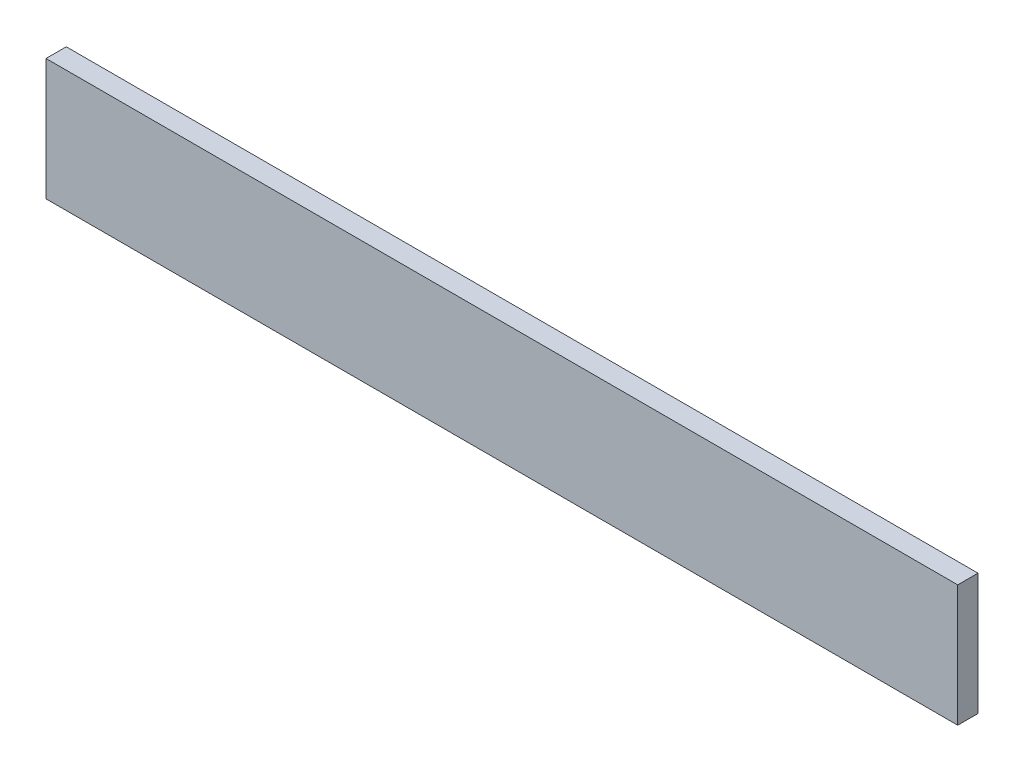
ISO-10303-21;
HEADER;
FILE_DESCRIPTION(('STEP AP214'),'2;1');
FILE_NAME('part.step','',(''),(''),'','','');
FILE_SCHEMA(('AUTOMOTIVE_DESIGN { 1 0 10303 214 1 1 1 1 }'));
ENDSEC;
DATA;
#1=APPLICATION_CONTEXT('core data for automotive mechanical design processes');
#2=APPLICATION_PROTOCOL_DEFINITION('international standard','automotive_design',2000,#1);
#3=PRODUCT_CONTEXT('',#1,'mechanical');
#4=PRODUCT('Part','Part','',(#3));
#5=PRODUCT_RELATED_PRODUCT_CATEGORY('part','',(#4));
#6=PRODUCT_DEFINITION_FORMATION('','',#4);
#7=PRODUCT_DEFINITION_CONTEXT('part definition',#1,'design');
#8=PRODUCT_DEFINITION('design','',#6,#7);
#9=PRODUCT_DEFINITION_SHAPE('','',#8);
#10=(LENGTH_UNIT() NAMED_UNIT(*) SI_UNIT(.MILLI.,.METRE.));
#11=(NAMED_UNIT(*) PLANE_ANGLE_UNIT() SI_UNIT($,.RADIAN.));
#12=(NAMED_UNIT(*) SI_UNIT($,.STERADIAN.) SOLID_ANGLE_UNIT());
#13=UNCERTAINTY_MEASURE_WITH_UNIT(LENGTH_MEASURE(1.E-05),#10,'distance_accuracy_value','');
#14=(GEOMETRIC_REPRESENTATION_CONTEXT(3) GLOBAL_UNCERTAINTY_ASSIGNED_CONTEXT((#13)) GLOBAL_UNIT_ASSIGNED_CONTEXT((#10,
#11,#12)) REPRESENTATION_CONTEXT('',''));
#15=CARTESIAN_POINT('',(0.,0.,0.));
#16=DIRECTION('',(0.,0.,1.));
#17=DIRECTION('',(1.,0.,0.));
#18=AXIS2_PLACEMENT_3D('',#15,#16,#17);
#19=CARTESIAN_POINT('',(-270.,0.,6.));
#20=DIRECTION('',(0.,1.,0.));
#21=DIRECTION('',(0.,0.,1.));
#22=AXIS2_PLACEMENT_3D('',#19,#20,#21);
#23=PLANE('',#22);
#24=DIRECTION('',(1.,0.,0.));
#25=VECTOR('',#24,1.);
#26=CARTESIAN_POINT('',(-270.,0.,0.));
#27=LINE('',#26,#25);
#28=CARTESIAN_POINT('',(-270.,0.,0.));
#29=VERTEX_POINT('',#28);
#30=CARTESIAN_POINT('',(0.,0.,0.));
#31=VERTEX_POINT('',#30);
#32=EDGE_CURVE('E96',#29,#31,#27,.T.);
#33=ORIENTED_EDGE('',*,*,#32,.T.);
#34=DIRECTION('',(0.,0.,-1.));
#35=VECTOR('',#34,1.);
#36=CARTESIAN_POINT('',(0.,0.,6.));
#37=LINE('',#36,#35);
#38=CARTESIAN_POINT('',(0.,0.,6.));
#39=VERTEX_POINT('',#38);
#40=EDGE_CURVE('E11',#39,#31,#37,.T.);
#41=ORIENTED_EDGE('',*,*,#40,.F.);
#42=DIRECTION('',(1.,0.,0.));
#43=VECTOR('',#42,1.);
#44=CARTESIAN_POINT('',(-270.,0.,6.));
#45=LINE('',#44,#43);
#46=CARTESIAN_POINT('',(-270.,0.,6.));
#47=VERTEX_POINT('',#46);
#48=EDGE_CURVE('E84',#47,#39,#45,.T.);
#49=ORIENTED_EDGE('',*,*,#48,.F.);
#50=DIRECTION('',(0.,0.,-1.));
#51=VECTOR('',#50,1.);
#52=CARTESIAN_POINT('',(-270.,0.,6.));
#53=LINE('',#52,#51);
#54=EDGE_CURVE('E92',#47,#29,#53,.T.);
#55=ORIENTED_EDGE('',*,*,#54,.T.);
#56=EDGE_LOOP('',(#33,#41,#49,#55));
#57=FACE_BOUND('',#56,.T.);
#58=ADVANCED_FACE('F33',(#57),#23,.F.);
#59=CARTESIAN_POINT('',(0.,0.,6.));
#60=DIRECTION('',(-1.,0.,0.));
#61=DIRECTION('',(0.,0.,1.));
#62=AXIS2_PLACEMENT_3D('',#59,#60,#61);
#63=PLANE('',#62);
#64=DIRECTION('',(0.,1.,0.));
#65=VECTOR('',#64,1.);
#66=CARTESIAN_POINT('',(0.,0.,0.));
#67=LINE('',#66,#65);
#68=CARTESIAN_POINT('',(0.,36.,0.));
#69=VERTEX_POINT('',#68);
#70=EDGE_CURVE('E88',#31,#69,#67,.T.);
#71=ORIENTED_EDGE('',*,*,#70,.T.);
#72=DIRECTION('',(0.,0.,-1.));
#73=VECTOR('',#72,1.);
#74=CARTESIAN_POINT('',(0.,36.,6.));
#75=LINE('',#74,#73);
#76=CARTESIAN_POINT('',(0.,36.,6.));
#77=VERTEX_POINT('',#76);
#78=EDGE_CURVE('E41',#77,#69,#75,.T.);
#79=ORIENTED_EDGE('',*,*,#78,.F.);
#80=DIRECTION('',(0.,1.,0.));
#81=VECTOR('',#80,1.);
#82=CARTESIAN_POINT('',(0.,0.,6.));
#83=LINE('',#82,#81);
#84=EDGE_CURVE('E79',#39,#77,#83,.T.);
#85=ORIENTED_EDGE('',*,*,#84,.F.);
#86=ORIENTED_EDGE('',*,*,#40,.T.);
#87=EDGE_LOOP('',(#71,#79,#85,#86));
#88=FACE_BOUND('',#87,.T.);
#89=ADVANCED_FACE('F87',(#88),#63,.F.);
#90=CARTESIAN_POINT('',(0.,36.,6.));
#91=DIRECTION('',(0.,-1.,0.));
#92=DIRECTION('',(0.,0.,-1.));
#93=AXIS2_PLACEMENT_3D('',#90,#91,#92);
#94=PLANE('',#93);
#95=DIRECTION('',(-1.,0.,0.));
#96=VECTOR('',#95,1.);
#97=CARTESIAN_POINT('',(0.,36.,0.));
#98=LINE('',#97,#96);
#99=CARTESIAN_POINT('',(-270.,36.,0.));
#100=VERTEX_POINT('',#99);
#101=EDGE_CURVE('E66',#69,#100,#98,.T.);
#102=ORIENTED_EDGE('',*,*,#101,.T.);
#103=DIRECTION('',(0.,0.,-1.));
#104=VECTOR('',#103,1.);
#105=CARTESIAN_POINT('',(-270.,36.,6.));
#106=LINE('',#105,#104);
#107=CARTESIAN_POINT('',(-270.,36.,6.));
#108=VERTEX_POINT('',#107);
#109=EDGE_CURVE('E89',#108,#100,#106,.T.);
#110=ORIENTED_EDGE('',*,*,#109,.F.);
#111=DIRECTION('',(-1.,0.,0.));
#112=VECTOR('',#111,1.);
#113=CARTESIAN_POINT('',(0.,36.,6.));
#114=LINE('',#113,#112);
#115=EDGE_CURVE('E82',#77,#108,#114,.T.);
#116=ORIENTED_EDGE('',*,*,#115,.F.);
#117=ORIENTED_EDGE('',*,*,#78,.T.);
#118=EDGE_LOOP('',(#102,#110,#116,#117));
#119=FACE_BOUND('',#118,.T.);
#120=ADVANCED_FACE('F90',(#119),#94,.F.);
#121=CARTESIAN_POINT('',(-270.,36.,6.));
#122=DIRECTION('',(1.,0.,0.));
#123=DIRECTION('',(0.,0.,-1.));
#124=AXIS2_PLACEMENT_3D('',#121,#122,#123);
#125=PLANE('',#124);
#126=DIRECTION('',(0.,-1.,0.));
#127=VECTOR('',#126,1.);
#128=CARTESIAN_POINT('',(-270.,36.,0.));
#129=LINE('',#128,#127);
#130=EDGE_CURVE('E72',#100,#29,#129,.T.);
#131=ORIENTED_EDGE('',*,*,#130,.T.);
#132=ORIENTED_EDGE('',*,*,#54,.F.);
#133=DIRECTION('',(0.,-1.,0.));
#134=VECTOR('',#133,1.);
#135=CARTESIAN_POINT('',(-270.,36.,6.));
#136=LINE('',#135,#134);
#137=EDGE_CURVE('E49',#108,#47,#136,.T.);
#138=ORIENTED_EDGE('',*,*,#137,.F.);
#139=ORIENTED_EDGE('',*,*,#109,.T.);
#140=EDGE_LOOP('',(#131,#132,#138,#139));
#141=FACE_BOUND('',#140,.T.);
#142=ADVANCED_FACE('F103',(#141),#125,.F.);
#143=CARTESIAN_POINT('',(0.,0.,6.));
#144=DIRECTION('',(0.,0.,1.));
#145=DIRECTION('',(1.,0.,0.));
#146=AXIS2_PLACEMENT_3D('',#143,#144,#145);
#147=PLANE('',#146);
#148=ORIENTED_EDGE('',*,*,#48,.T.);
#149=ORIENTED_EDGE('',*,*,#84,.T.);
#150=ORIENTED_EDGE('',*,*,#115,.T.);
#151=ORIENTED_EDGE('',*,*,#137,.T.);
#152=EDGE_LOOP('',(#148,#149,#150,#151));
#153=FACE_BOUND('',#152,.T.);
#154=ADVANCED_FACE('F80',(#153),#147,.T.);
#155=CARTESIAN_POINT('',(0.,0.,0.));
#156=DIRECTION('',(0.,0.,1.));
#157=DIRECTION('',(1.,0.,0.));
#158=AXIS2_PLACEMENT_3D('',#155,#156,#157);
#159=PLANE('',#158);
#160=ORIENTED_EDGE('',*,*,#32,.F.);
#161=ORIENTED_EDGE('',*,*,#130,.F.);
#162=ORIENTED_EDGE('',*,*,#101,.F.);
#163=ORIENTED_EDGE('',*,*,#70,.F.);
#164=EDGE_LOOP('',(#160,#161,#162,#163));
#165=FACE_BOUND('',#164,.T.);
#166=ADVANCED_FACE('F106',(#165),#159,.F.);
#167=CLOSED_SHELL('',(#58,#89,#120,#142,#154,#166));
#168=MANIFOLD_SOLID_BREP('B2',#167);
#169=ADVANCED_BREP_SHAPE_REPRESENTATION('',(#18,#168),#14);
#170=SHAPE_DEFINITION_REPRESENTATION(#9,#169);
ENDSEC;
END-ISO-10303-21;
